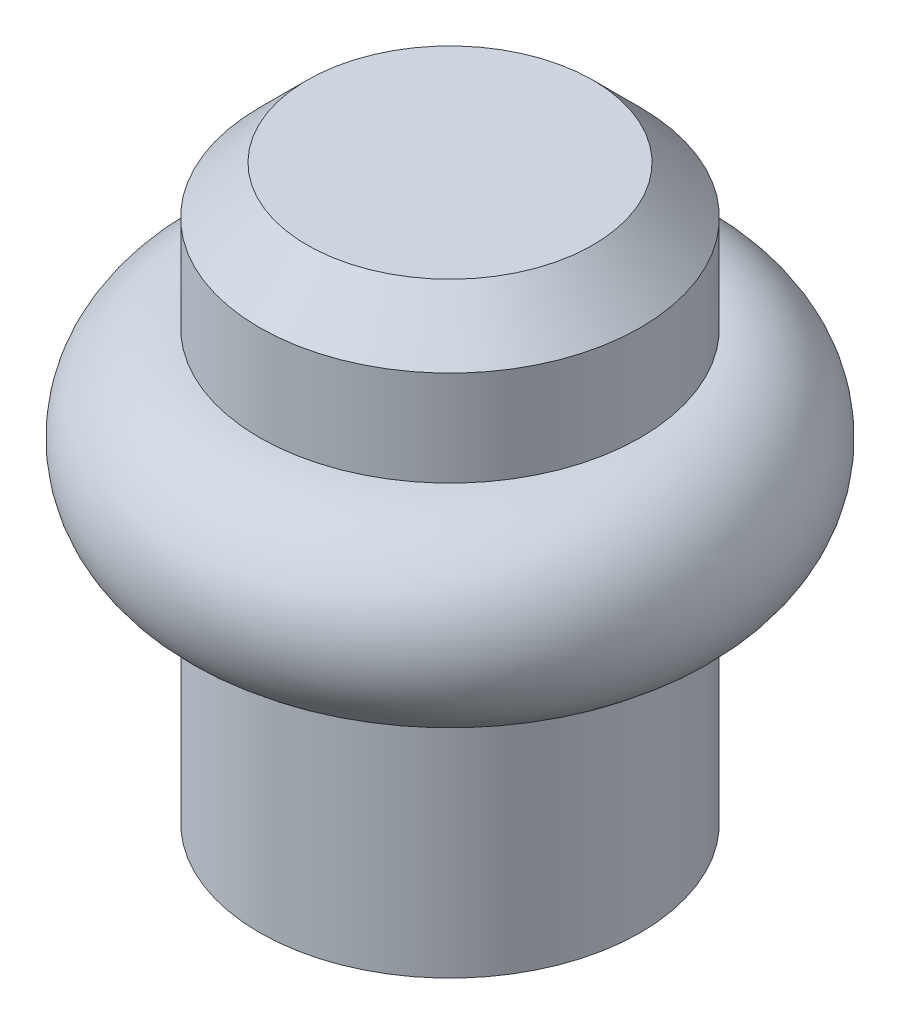
ISO-10303-21;
HEADER;
FILE_DESCRIPTION(('STEP AP214'),'2;1');
FILE_NAME('part.step','',(''),(''),'','','');
FILE_SCHEMA(('AUTOMOTIVE_DESIGN { 1 0 10303 214 1 1 1 1 }'));
ENDSEC;
DATA;
#1=APPLICATION_CONTEXT('core data for automotive mechanical design processes');
#2=APPLICATION_PROTOCOL_DEFINITION('international standard','automotive_design',2000,#1);
#3=PRODUCT_CONTEXT('',#1,'mechanical');
#4=PRODUCT('Part','Part','',(#3));
#5=PRODUCT_RELATED_PRODUCT_CATEGORY('part','',(#4));
#6=PRODUCT_DEFINITION_FORMATION('','',#4);
#7=PRODUCT_DEFINITION_CONTEXT('part definition',#1,'design');
#8=PRODUCT_DEFINITION('design','',#6,#7);
#9=PRODUCT_DEFINITION_SHAPE('','',#8);
#10=(LENGTH_UNIT() NAMED_UNIT(*) SI_UNIT(.MILLI.,.METRE.));
#11=(NAMED_UNIT(*) PLANE_ANGLE_UNIT() SI_UNIT($,.RADIAN.));
#12=(NAMED_UNIT(*) SI_UNIT($,.STERADIAN.) SOLID_ANGLE_UNIT());
#13=UNCERTAINTY_MEASURE_WITH_UNIT(LENGTH_MEASURE(1.E-05),#10,'distance_accuracy_value','');
#14=(GEOMETRIC_REPRESENTATION_CONTEXT(3) GLOBAL_UNCERTAINTY_ASSIGNED_CONTEXT((#13)) GLOBAL_UNIT_ASSIGNED_CONTEXT((#10,
#11,#12)) REPRESENTATION_CONTEXT('',''));
#15=CARTESIAN_POINT('',(0.,0.,0.));
#16=DIRECTION('',(0.,0.,1.));
#17=DIRECTION('',(1.,0.,0.));
#18=AXIS2_PLACEMENT_3D('',#15,#16,#17);
#19=CARTESIAN_POINT('',(0.,0.,1.));
#20=DIRECTION('',(0.,1.,0.));
#21=DIRECTION('',(0.,0.,1.));
#22=AXIS2_PLACEMENT_3D('',#19,#20,#21);
#23=PLANE('',#22);
#24=CARTESIAN_POINT('',(0.,0.,0.));
#25=DIRECTION('',(0.,-1.,0.));
#26=DIRECTION('',(0.,0.,-1.));
#27=AXIS2_PLACEMENT_3D('',#24,#25,#26);
#28=CIRCLE('',#27,1.);
#29=CARTESIAN_POINT('',(0.,0.,-1.));
#30=VERTEX_POINT('',#29);
#31=EDGE_CURVE('E57',#30,#30,#28,.T.);
#32=ORIENTED_EDGE('',*,*,#31,.T.);
#33=EDGE_LOOP('',(#32));
#34=FACE_BOUND('',#33,.T.);
#35=ADVANCED_FACE('F40',(#34),#23,.F.);
#36=CARTESIAN_POINT('',(0.,3.,0.));
#37=DIRECTION('',(0.,-1.,0.));
#38=DIRECTION('',(0.,0.,-1.));
#39=AXIS2_PLACEMENT_3D('',#36,#37,#38);
#40=PLANE('',#39);
#41=CARTESIAN_POINT('',(0.,3.,0.));
#42=DIRECTION('',(0.,-1.,0.));
#43=DIRECTION('',(0.,0.,-1.));
#44=AXIS2_PLACEMENT_3D('',#41,#42,#43);
#45=CIRCLE('',#44,0.750000000000001);
#46=CARTESIAN_POINT('',(0.,3.,-0.750000000000001));
#47=VERTEX_POINT('',#46);
#48=EDGE_CURVE('E10',#47,#47,#45,.T.);
#49=ORIENTED_EDGE('',*,*,#48,.F.);
#50=EDGE_LOOP('',(#49));
#51=FACE_BOUND('',#50,.T.);
#52=ADVANCED_FACE('F79',(#51),#40,.F.);
#53=CARTESIAN_POINT('',(0.,3.,0.));
#54=DIRECTION('',(0.,-1.,0.));
#55=DIRECTION('',(0.,0.,-1.));
#56=AXIS2_PLACEMENT_3D('',#53,#54,#55);
#57=CONICAL_SURFACE('',#56,0.750000000000001,0.785398163397446);
#58=CARTESIAN_POINT('',(0.,2.75,0.));
#59=DIRECTION('',(0.,-1.,0.));
#60=DIRECTION('',(0.,0.,-1.));
#61=AXIS2_PLACEMENT_3D('',#58,#59,#60);
#62=CIRCLE('',#61,1.);
#63=CARTESIAN_POINT('',(0.,2.75,-1.));
#64=VERTEX_POINT('',#63);
#65=EDGE_CURVE('E43',#64,#64,#62,.T.);
#66=ORIENTED_EDGE('',*,*,#65,.F.);
#67=EDGE_LOOP('',(#66));
#68=FACE_BOUND('',#67,.T.);
#69=ORIENTED_EDGE('',*,*,#48,.T.);
#70=EDGE_LOOP('',(#69));
#71=FACE_BOUND('',#70,.T.);
#72=ADVANCED_FACE('F75',(#68,#71),#57,.T.);
#73=CARTESIAN_POINT('',(0.,0.,0.));
#74=DIRECTION('',(0.,-1.,0.));
#75=DIRECTION('',(0.,0.,-1.));
#76=AXIS2_PLACEMENT_3D('',#73,#74,#75);
#77=CYLINDRICAL_SURFACE('',#76,1.);
#78=CARTESIAN_POINT('',(0.,2.25,0.));
#79=DIRECTION('',(0.,-1.,0.));
#80=DIRECTION('',(0.,0.,-1.));
#81=AXIS2_PLACEMENT_3D('',#78,#79,#80);
#82=CIRCLE('',#81,1.);
#83=CARTESIAN_POINT('',(0.,2.25,-1.));
#84=VERTEX_POINT('',#83);
#85=EDGE_CURVE('E50',#84,#84,#82,.T.);
#86=ORIENTED_EDGE('',*,*,#85,.F.);
#87=EDGE_LOOP('',(#86));
#88=FACE_BOUND('',#87,.T.);
#89=ORIENTED_EDGE('',*,*,#65,.T.);
#90=EDGE_LOOP('',(#89));
#91=FACE_BOUND('',#90,.T.);
#92=ADVANCED_FACE('F68',(#88,#91),#77,.T.);
#93=CARTESIAN_POINT('',(0.,1.75,0.));
#94=DIRECTION('',(0.,-1.,0.));
#95=DIRECTION('',(0.,0.,-1.));
#96=AXIS2_PLACEMENT_3D('',#93,#94,#95);
#97=TOROIDAL_SURFACE('',#96,1.,0.5);
#98=CARTESIAN_POINT('',(0.,1.25,0.));
#99=DIRECTION('',(0.,-1.,0.));
#100=DIRECTION('',(0.,0.,-1.));
#101=AXIS2_PLACEMENT_3D('',#98,#99,#100);
#102=CIRCLE('',#101,1.);
#103=CARTESIAN_POINT('',(0.,1.25,-1.));
#104=VERTEX_POINT('',#103);
#105=EDGE_CURVE('E51',#104,#104,#102,.T.);
#106=ORIENTED_EDGE('',*,*,#105,.F.);
#107=EDGE_LOOP('',(#106));
#108=FACE_BOUND('',#107,.T.);
#109=ORIENTED_EDGE('',*,*,#85,.T.);
#110=EDGE_LOOP('',(#109));
#111=FACE_BOUND('',#110,.T.);
#112=ADVANCED_FACE('F63',(#108,#111),#97,.T.);
#113=CARTESIAN_POINT('',(0.,0.,0.));
#114=DIRECTION('',(0.,-1.,0.));
#115=DIRECTION('',(0.,0.,-1.));
#116=AXIS2_PLACEMENT_3D('',#113,#114,#115);
#117=CYLINDRICAL_SURFACE('',#116,1.);
#118=ORIENTED_EDGE('',*,*,#31,.F.);
#119=EDGE_LOOP('',(#118));
#120=FACE_BOUND('',#119,.T.);
#121=ORIENTED_EDGE('',*,*,#105,.T.);
#122=EDGE_LOOP('',(#121));
#123=FACE_BOUND('',#122,.T.);
#124=ADVANCED_FACE('F61',(#120,#123),#117,.T.);
#125=CLOSED_SHELL('',(#35,#52,#72,#92,#112,#124));
#126=MANIFOLD_SOLID_BREP('B2',#125);
#127=ADVANCED_BREP_SHAPE_REPRESENTATION('',(#18,#126),#14);
#128=SHAPE_DEFINITION_REPRESENTATION(#9,#127);
ENDSEC;
END-ISO-10303-21;
